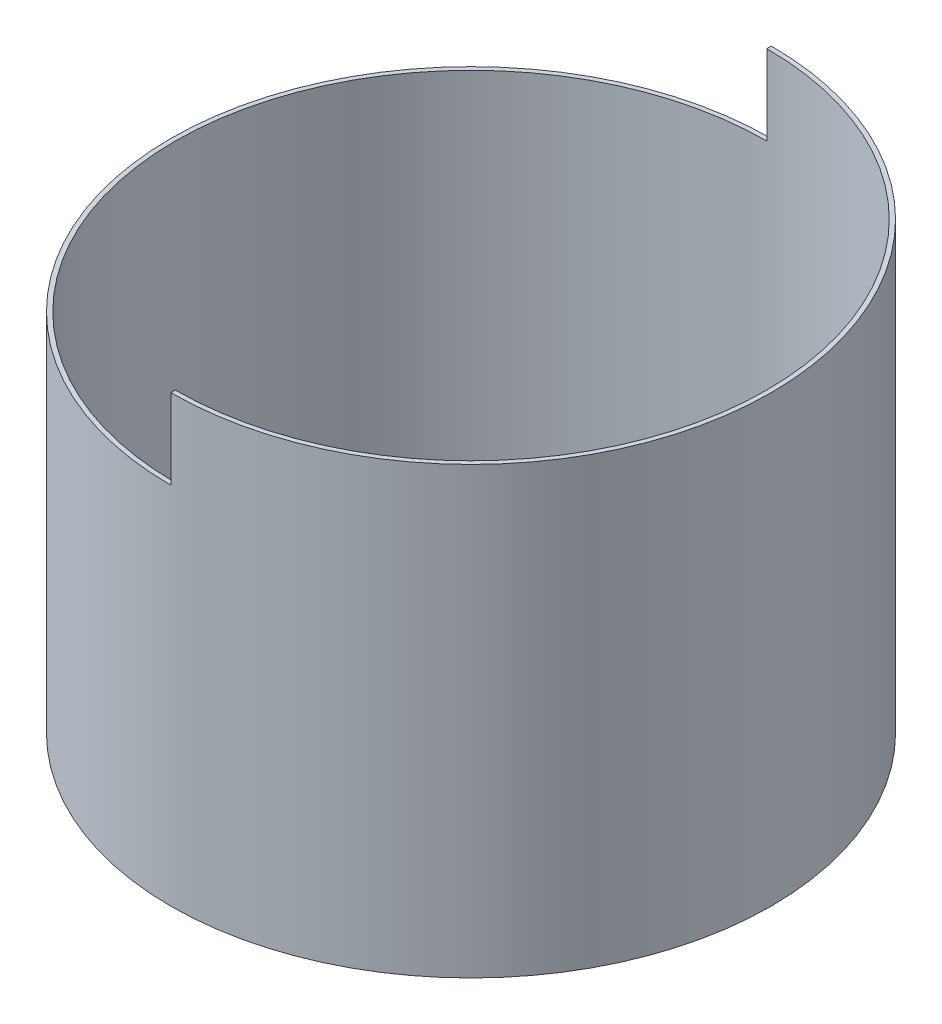
ISO-10303-21;
HEADER;
FILE_DESCRIPTION(('STEP AP214'),'2;1');
FILE_NAME('part.step','',(''),(''),'','','');
FILE_SCHEMA(('AUTOMOTIVE_DESIGN { 1 0 10303 214 1 1 1 1 }'));
ENDSEC;
DATA;
#1=APPLICATION_CONTEXT('core data for automotive mechanical design processes');
#2=APPLICATION_PROTOCOL_DEFINITION('international standard','automotive_design',2000,#1);
#3=PRODUCT_CONTEXT('',#1,'mechanical');
#4=PRODUCT('Part','Part','',(#3));
#5=PRODUCT_RELATED_PRODUCT_CATEGORY('part','',(#4));
#6=PRODUCT_DEFINITION_FORMATION('','',#4);
#7=PRODUCT_DEFINITION_CONTEXT('part definition',#1,'design');
#8=PRODUCT_DEFINITION('design','',#6,#7);
#9=PRODUCT_DEFINITION_SHAPE('','',#8);
#10=(LENGTH_UNIT() NAMED_UNIT(*) SI_UNIT(.MILLI.,.METRE.));
#11=(NAMED_UNIT(*) PLANE_ANGLE_UNIT() SI_UNIT($,.RADIAN.));
#12=(NAMED_UNIT(*) SI_UNIT($,.STERADIAN.) SOLID_ANGLE_UNIT());
#13=UNCERTAINTY_MEASURE_WITH_UNIT(LENGTH_MEASURE(1.E-05),#10,'distance_accuracy_value','');
#14=(GEOMETRIC_REPRESENTATION_CONTEXT(3) GLOBAL_UNCERTAINTY_ASSIGNED_CONTEXT((#13)) GLOBAL_UNIT_ASSIGNED_CONTEXT((#10,
#11,#12)) REPRESENTATION_CONTEXT('',''));
#15=CARTESIAN_POINT('',(0.,0.,0.));
#16=DIRECTION('',(0.,0.,1.));
#17=DIRECTION('',(1.,0.,0.));
#18=AXIS2_PLACEMENT_3D('',#15,#16,#17);
#19=CARTESIAN_POINT('',(0.,100.,0.));
#20=DIRECTION('',(0.,1.,0.));
#21=DIRECTION('',(0.,0.,1.));
#22=AXIS2_PLACEMENT_3D('',#19,#20,#21);
#23=PLANE('',#22);
#24=DIRECTION('',(0.,0.,-1.));
#25=VECTOR('',#24,1.);
#26=CARTESIAN_POINT('',(0.,100.,67.5));
#27=LINE('',#26,#25);
#28=CARTESIAN_POINT('',(0.,100.,67.5));
#29=VERTEX_POINT('',#28);
#30=CARTESIAN_POINT('',(0.,100.,66.5));
#31=VERTEX_POINT('',#30);
#32=EDGE_CURVE('E88',#29,#31,#27,.T.);
#33=ORIENTED_EDGE('',*,*,#32,.F.);
#34=CARTESIAN_POINT('',(0.,100.,0.));
#35=DIRECTION('',(0.,1.,0.));
#36=DIRECTION('',(0.,0.,1.));
#37=AXIS2_PLACEMENT_3D('',#34,#35,#36);
#38=CIRCLE('',#37,67.5);
#39=CARTESIAN_POINT('',(0.,100.,-67.5));
#40=VERTEX_POINT('',#39);
#41=EDGE_CURVE('E103',#29,#40,#38,.T.);
#42=ORIENTED_EDGE('',*,*,#41,.T.);
#43=CARTESIAN_POINT('',(0.,100.,-66.5));
#44=VERTEX_POINT('',#43);
#45=EDGE_CURVE('E92',#44,#40,#27,.T.);
#46=ORIENTED_EDGE('',*,*,#45,.F.);
#47=CARTESIAN_POINT('',(0.,100.,0.));
#48=DIRECTION('',(0.,1.,0.));
#49=DIRECTION('',(0.,0.,1.));
#50=AXIS2_PLACEMENT_3D('',#47,#48,#49);
#51=CIRCLE('',#50,66.5);
#52=EDGE_CURVE('E97',#31,#44,#51,.T.);
#53=ORIENTED_EDGE('',*,*,#52,.F.);
#54=EDGE_LOOP('',(#33,#42,#46,#53));
#55=FACE_BOUND('',#54,.T.);
#56=ADVANCED_FACE('F35',(#55),#23,.T.);
#57=CARTESIAN_POINT('',(0.,0.,0.));
#58=DIRECTION('',(0.,1.,0.));
#59=DIRECTION('',(0.,0.,1.));
#60=AXIS2_PLACEMENT_3D('',#57,#58,#59);
#61=PLANE('',#60);
#62=CARTESIAN_POINT('',(0.,0.,0.));
#63=DIRECTION('',(0.,1.,0.));
#64=DIRECTION('',(0.,0.,1.));
#65=AXIS2_PLACEMENT_3D('',#62,#63,#64);
#66=CIRCLE('',#65,67.5);
#67=CARTESIAN_POINT('',(0.,0.,67.5));
#68=VERTEX_POINT('',#67);
#69=EDGE_CURVE('E100',#68,#68,#66,.T.);
#70=ORIENTED_EDGE('',*,*,#69,.F.);
#71=EDGE_LOOP('',(#70));
#72=FACE_BOUND('',#71,.T.);
#73=CARTESIAN_POINT('',(0.,0.,0.));
#74=DIRECTION('',(0.,1.,0.));
#75=DIRECTION('',(0.,0.,1.));
#76=AXIS2_PLACEMENT_3D('',#73,#74,#75);
#77=CIRCLE('',#76,66.5);
#78=CARTESIAN_POINT('',(0.,0.,66.5));
#79=VERTEX_POINT('',#78);
#80=EDGE_CURVE('E82',#79,#79,#77,.T.);
#81=ORIENTED_EDGE('',*,*,#80,.T.);
#82=EDGE_LOOP('',(#81));
#83=FACE_BOUND('',#82,.T.);
#84=ADVANCED_FACE('F126',(#72,#83),#61,.F.);
#85=CARTESIAN_POINT('',(0.,100.,0.));
#86=DIRECTION('',(0.,-1.,0.));
#87=DIRECTION('',(0.,0.,-1.));
#88=AXIS2_PLACEMENT_3D('',#85,#86,#87);
#89=CYLINDRICAL_SURFACE('',#88,67.5);
#90=ORIENTED_EDGE('',*,*,#41,.F.);
#91=DIRECTION('',(0.,1.,0.));
#92=VECTOR('',#91,1.);
#93=CARTESIAN_POINT('',(0.,82.,67.5));
#94=LINE('',#93,#92);
#95=CARTESIAN_POINT('',(0.,82.,67.5));
#96=VERTEX_POINT('',#95);
#97=EDGE_CURVE('E81',#96,#29,#94,.T.);
#98=ORIENTED_EDGE('',*,*,#97,.F.);
#99=CARTESIAN_POINT('',(0.,82.,0.));
#100=DIRECTION('',(0.,-1.,0.));
#101=DIRECTION('',(0.,0.,-1.));
#102=AXIS2_PLACEMENT_3D('',#99,#100,#101);
#103=CIRCLE('',#102,67.5);
#104=CARTESIAN_POINT('',(0.,82.,-67.5));
#105=VERTEX_POINT('',#104);
#106=EDGE_CURVE('E75',#96,#105,#103,.T.);
#107=ORIENTED_EDGE('',*,*,#106,.T.);
#108=DIRECTION('',(0.,1.,0.));
#109=VECTOR('',#108,1.);
#110=CARTESIAN_POINT('',(0.,82.,-67.5));
#111=LINE('',#110,#109);
#112=EDGE_CURVE('E79',#105,#40,#111,.T.);
#113=ORIENTED_EDGE('',*,*,#112,.T.);
#114=EDGE_LOOP('',(#90,#98,#107,#113));
#115=FACE_BOUND('',#114,.T.);
#116=ORIENTED_EDGE('',*,*,#69,.T.);
#117=EDGE_LOOP('',(#116));
#118=FACE_BOUND('',#117,.T.);
#119=ADVANCED_FACE('F37',(#115,#118),#89,.T.);
#120=CARTESIAN_POINT('',(0.,100.,0.));
#121=DIRECTION('',(0.,-1.,0.));
#122=DIRECTION('',(0.,0.,-1.));
#123=AXIS2_PLACEMENT_3D('',#120,#121,#122);
#124=CYLINDRICAL_SURFACE('',#123,66.5);
#125=DIRECTION('',(0.,-1.,0.));
#126=VECTOR('',#125,1.);
#127=CARTESIAN_POINT('',(0.,100.,66.5));
#128=LINE('',#127,#126);
#129=CARTESIAN_POINT('',(0.,82.,66.5));
#130=VERTEX_POINT('',#129);
#131=EDGE_CURVE('E11',#31,#130,#128,.T.);
#132=ORIENTED_EDGE('',*,*,#131,.F.);
#133=ORIENTED_EDGE('',*,*,#52,.T.);
#134=DIRECTION('',(0.,-1.,0.));
#135=VECTOR('',#134,1.);
#136=CARTESIAN_POINT('',(0.,100.,-66.5));
#137=LINE('',#136,#135);
#138=CARTESIAN_POINT('',(0.,82.,-66.5));
#139=VERTEX_POINT('',#138);
#140=EDGE_CURVE('E43',#139,#44,#137,.F.);
#141=ORIENTED_EDGE('',*,*,#140,.F.);
#142=CARTESIAN_POINT('',(0.,82.,0.));
#143=DIRECTION('',(0.,-1.,0.));
#144=DIRECTION('',(0.,0.,-1.));
#145=AXIS2_PLACEMENT_3D('',#142,#143,#144);
#146=CIRCLE('',#145,66.5);
#147=EDGE_CURVE('E54',#130,#139,#146,.T.);
#148=ORIENTED_EDGE('',*,*,#147,.F.);
#149=EDGE_LOOP('',(#132,#133,#141,#148));
#150=FACE_BOUND('',#149,.T.);
#151=ORIENTED_EDGE('',*,*,#80,.F.);
#152=EDGE_LOOP('',(#151));
#153=FACE_BOUND('',#152,.T.);
#154=ADVANCED_FACE('F112',(#150,#153),#124,.F.);
#155=CARTESIAN_POINT('',(0.,82.,67.5));
#156=DIRECTION('',(1.,0.,0.));
#157=DIRECTION('',(0.,0.,-1.));
#158=AXIS2_PLACEMENT_3D('',#155,#156,#157);
#159=PLANE('',#158);
#160=ORIENTED_EDGE('',*,*,#131,.T.);
#161=DIRECTION('',(0.,0.,-1.));
#162=VECTOR('',#161,1.);
#163=CARTESIAN_POINT('',(0.,82.,67.5));
#164=LINE('',#163,#162);
#165=EDGE_CURVE('E50',#96,#130,#164,.T.);
#166=ORIENTED_EDGE('',*,*,#165,.F.);
#167=ORIENTED_EDGE('',*,*,#97,.T.);
#168=ORIENTED_EDGE('',*,*,#32,.T.);
#169=EDGE_LOOP('',(#160,#166,#167,#168));
#170=FACE_BOUND('',#169,.T.);
#171=ADVANCED_FACE('F115',(#170),#159,.F.);
#172=CARTESIAN_POINT('',(0.,82.,0.));
#173=DIRECTION('',(0.,-1.,0.));
#174=DIRECTION('',(0.,0.,-1.));
#175=AXIS2_PLACEMENT_3D('',#172,#173,#174);
#176=PLANE('',#175);
#177=ORIENTED_EDGE('',*,*,#165,.T.);
#178=ORIENTED_EDGE('',*,*,#147,.T.);
#179=EDGE_CURVE('E84',#139,#105,#164,.T.);
#180=ORIENTED_EDGE('',*,*,#179,.T.);
#181=ORIENTED_EDGE('',*,*,#106,.F.);
#182=EDGE_LOOP('',(#177,#178,#180,#181));
#183=FACE_BOUND('',#182,.T.);
#184=ADVANCED_FACE('F85',(#183),#176,.F.);
#185=ORIENTED_EDGE('',*,*,#140,.T.);
#186=ORIENTED_EDGE('',*,*,#45,.T.);
#187=ORIENTED_EDGE('',*,*,#112,.F.);
#188=ORIENTED_EDGE('',*,*,#179,.F.);
#189=EDGE_LOOP('',(#185,#186,#187,#188));
#190=FACE_BOUND('',#189,.T.);
#191=ADVANCED_FACE('F90',(#190),#159,.F.);
#192=CLOSED_SHELL('',(#56,#84,#119,#154,#171,#184,#191));
#193=MANIFOLD_SOLID_BREP('B2',#192);
#194=ADVANCED_BREP_SHAPE_REPRESENTATION('',(#18,#193),#14);
#195=SHAPE_DEFINITION_REPRESENTATION(#9,#194);
ENDSEC;
END-ISO-10303-21;
